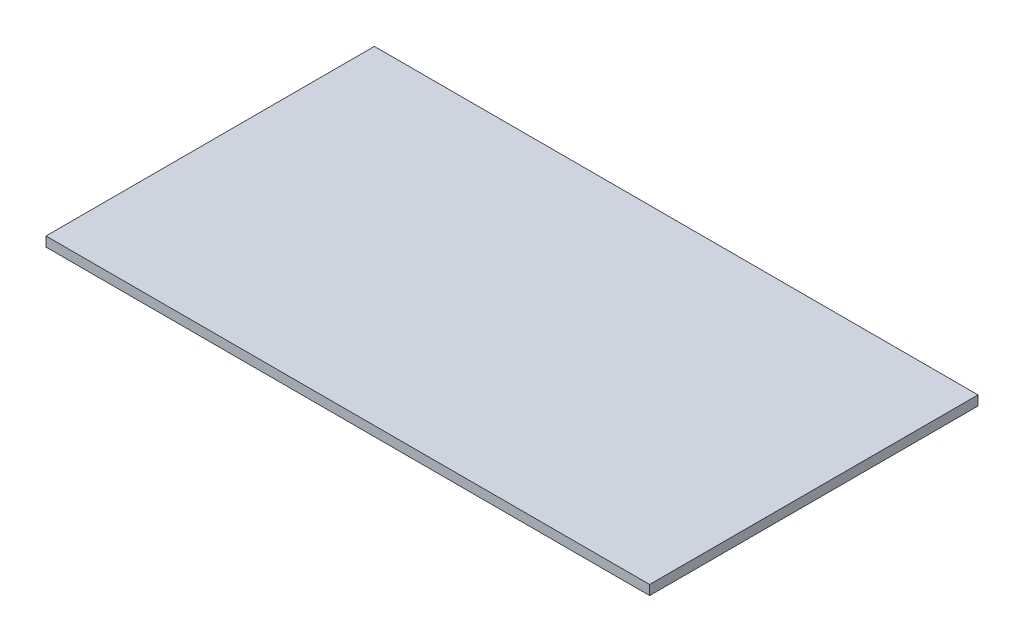
ISO-10303-21;
HEADER;
FILE_DESCRIPTION(('STEP AP214'),'2;1');
FILE_NAME('part.step','',(''),(''),'','','');
FILE_SCHEMA(('AUTOMOTIVE_DESIGN { 1 0 10303 214 1 1 1 1 }'));
ENDSEC;
DATA;
#1=APPLICATION_CONTEXT('core data for automotive mechanical design processes');
#2=APPLICATION_PROTOCOL_DEFINITION('international standard','automotive_design',2000,#1);
#3=PRODUCT_CONTEXT('',#1,'mechanical');
#4=PRODUCT('Part','Part','',(#3));
#5=PRODUCT_RELATED_PRODUCT_CATEGORY('part','',(#4));
#6=PRODUCT_DEFINITION_FORMATION('','',#4);
#7=PRODUCT_DEFINITION_CONTEXT('part definition',#1,'design');
#8=PRODUCT_DEFINITION('design','',#6,#7);
#9=PRODUCT_DEFINITION_SHAPE('','',#8);
#10=(LENGTH_UNIT() NAMED_UNIT(*) SI_UNIT(.MILLI.,.METRE.));
#11=(NAMED_UNIT(*) PLANE_ANGLE_UNIT() SI_UNIT($,.RADIAN.));
#12=(NAMED_UNIT(*) SI_UNIT($,.STERADIAN.) SOLID_ANGLE_UNIT());
#13=UNCERTAINTY_MEASURE_WITH_UNIT(LENGTH_MEASURE(1.E-05),#10,'distance_accuracy_value','');
#14=(GEOMETRIC_REPRESENTATION_CONTEXT(3) GLOBAL_UNCERTAINTY_ASSIGNED_CONTEXT((#13)) GLOBAL_UNIT_ASSIGNED_CONTEXT((#10,
#11,#12)) REPRESENTATION_CONTEXT('',''));
#15=CARTESIAN_POINT('',(0.,0.,0.));
#16=DIRECTION('',(0.,0.,1.));
#17=DIRECTION('',(1.,0.,0.));
#18=AXIS2_PLACEMENT_3D('',#15,#16,#17);
#19=CARTESIAN_POINT('',(-132.035842293907,4.,-136.));
#20=DIRECTION('',(1.,0.,0.));
#21=DIRECTION('',(0.,0.,-1.));
#22=AXIS2_PLACEMENT_3D('',#19,#20,#21);
#23=PLANE('',#22);
#24=DIRECTION('',(0.,0.,1.));
#25=VECTOR('',#24,1.);
#26=CARTESIAN_POINT('',(-132.035842293907,0.,-136.));
#27=LINE('',#26,#25);
#28=CARTESIAN_POINT('',(-132.035842293907,0.,-136.));
#29=VERTEX_POINT('',#28);
#30=CARTESIAN_POINT('',(-132.035842293907,0.,0.));
#31=VERTEX_POINT('',#30);
#32=EDGE_CURVE('E95',#29,#31,#27,.T.);
#33=ORIENTED_EDGE('',*,*,#32,.T.);
#34=DIRECTION('',(0.,-1.,0.));
#35=VECTOR('',#34,1.);
#36=CARTESIAN_POINT('',(-132.035842293907,4.,0.));
#37=LINE('',#36,#35);
#38=CARTESIAN_POINT('',(-132.035842293907,4.,0.));
#39=VERTEX_POINT('',#38);
#40=EDGE_CURVE('E11',#39,#31,#37,.T.);
#41=ORIENTED_EDGE('',*,*,#40,.F.);
#42=DIRECTION('',(0.,0.,1.));
#43=VECTOR('',#42,1.);
#44=CARTESIAN_POINT('',(-132.035842293907,4.,-136.));
#45=LINE('',#44,#43);
#46=CARTESIAN_POINT('',(-132.035842293907,4.,-136.));
#47=VERTEX_POINT('',#46);
#48=EDGE_CURVE('E83',#47,#39,#45,.T.);
#49=ORIENTED_EDGE('',*,*,#48,.F.);
#50=DIRECTION('',(0.,-1.,0.));
#51=VECTOR('',#50,1.);
#52=CARTESIAN_POINT('',(-132.035842293907,4.,-136.));
#53=LINE('',#52,#51);
#54=EDGE_CURVE('E91',#47,#29,#53,.T.);
#55=ORIENTED_EDGE('',*,*,#54,.T.);
#56=EDGE_LOOP('',(#33,#41,#49,#55));
#57=FACE_BOUND('',#56,.T.);
#58=ADVANCED_FACE('F32',(#57),#23,.F.);
#59=CARTESIAN_POINT('',(-132.035842293907,4.,0.));
#60=DIRECTION('',(0.,0.,-1.));
#61=DIRECTION('',(-1.,0.,0.));
#62=AXIS2_PLACEMENT_3D('',#59,#60,#61);
#63=PLANE('',#62);
#64=DIRECTION('',(1.,0.,0.));
#65=VECTOR('',#64,1.);
#66=CARTESIAN_POINT('',(-132.035842293907,0.,0.));
#67=LINE('',#66,#65);
#68=CARTESIAN_POINT('',(117.964157706093,0.,0.));
#69=VERTEX_POINT('',#68);
#70=EDGE_CURVE('E87',#31,#69,#67,.T.);
#71=ORIENTED_EDGE('',*,*,#70,.T.);
#72=DIRECTION('',(0.,-1.,0.));
#73=VECTOR('',#72,1.);
#74=CARTESIAN_POINT('',(117.964157706093,4.,0.));
#75=LINE('',#74,#73);
#76=CARTESIAN_POINT('',(117.964157706093,4.,0.));
#77=VERTEX_POINT('',#76);
#78=EDGE_CURVE('E40',#77,#69,#75,.T.);
#79=ORIENTED_EDGE('',*,*,#78,.F.);
#80=DIRECTION('',(1.,0.,0.));
#81=VECTOR('',#80,1.);
#82=CARTESIAN_POINT('',(-132.035842293907,4.,0.));
#83=LINE('',#82,#81);
#84=EDGE_CURVE('E78',#39,#77,#83,.T.);
#85=ORIENTED_EDGE('',*,*,#84,.F.);
#86=ORIENTED_EDGE('',*,*,#40,.T.);
#87=EDGE_LOOP('',(#71,#79,#85,#86));
#88=FACE_BOUND('',#87,.T.);
#89=ADVANCED_FACE('F86',(#88),#63,.F.);
#90=CARTESIAN_POINT('',(117.964157706093,4.,-136.));
#91=DIRECTION('',(-1.,0.,0.));
#92=DIRECTION('',(0.,0.,1.));
#93=AXIS2_PLACEMENT_3D('',#90,#91,#92);
#94=PLANE('',#93);
#95=DIRECTION('',(0.,0.,-1.));
#96=VECTOR('',#95,1.);
#97=CARTESIAN_POINT('',(117.964157706093,0.,-136.));
#98=LINE('',#97,#96);
#99=CARTESIAN_POINT('',(117.964157706093,0.,-136.));
#100=VERTEX_POINT('',#99);
#101=EDGE_CURVE('E65',#69,#100,#98,.T.);
#102=ORIENTED_EDGE('',*,*,#101,.T.);
#103=DIRECTION('',(0.,-1.,0.));
#104=VECTOR('',#103,1.);
#105=CARTESIAN_POINT('',(117.964157706093,4.,-136.));
#106=LINE('',#105,#104);
#107=CARTESIAN_POINT('',(117.964157706093,4.,-136.));
#108=VERTEX_POINT('',#107);
#109=EDGE_CURVE('E88',#108,#100,#106,.T.);
#110=ORIENTED_EDGE('',*,*,#109,.F.);
#111=DIRECTION('',(0.,0.,-1.));
#112=VECTOR('',#111,1.);
#113=CARTESIAN_POINT('',(117.964157706093,4.,-136.));
#114=LINE('',#113,#112);
#115=EDGE_CURVE('E81',#77,#108,#114,.T.);
#116=ORIENTED_EDGE('',*,*,#115,.F.);
#117=ORIENTED_EDGE('',*,*,#78,.T.);
#118=EDGE_LOOP('',(#102,#110,#116,#117));
#119=FACE_BOUND('',#118,.T.);
#120=ADVANCED_FACE('F89',(#119),#94,.F.);
#121=CARTESIAN_POINT('',(-132.035842293907,4.,-136.));
#122=DIRECTION('',(0.,0.,1.));
#123=DIRECTION('',(1.,0.,0.));
#124=AXIS2_PLACEMENT_3D('',#121,#122,#123);
#125=PLANE('',#124);
#126=DIRECTION('',(-1.,0.,0.));
#127=VECTOR('',#126,1.);
#128=CARTESIAN_POINT('',(-132.035842293907,0.,-136.));
#129=LINE('',#128,#127);
#130=EDGE_CURVE('E71',#100,#29,#129,.T.);
#131=ORIENTED_EDGE('',*,*,#130,.T.);
#132=ORIENTED_EDGE('',*,*,#54,.F.);
#133=DIRECTION('',(-1.,0.,0.));
#134=VECTOR('',#133,1.);
#135=CARTESIAN_POINT('',(-132.035842293907,4.,-136.));
#136=LINE('',#135,#134);
#137=EDGE_CURVE('E48',#108,#47,#136,.T.);
#138=ORIENTED_EDGE('',*,*,#137,.F.);
#139=ORIENTED_EDGE('',*,*,#109,.T.);
#140=EDGE_LOOP('',(#131,#132,#138,#139));
#141=FACE_BOUND('',#140,.T.);
#142=ADVANCED_FACE('F102',(#141),#125,.F.);
#143=CARTESIAN_POINT('',(0.,4.,0.));
#144=DIRECTION('',(0.,1.,0.));
#145=DIRECTION('',(0.,0.,1.));
#146=AXIS2_PLACEMENT_3D('',#143,#144,#145);
#147=PLANE('',#146);
#148=ORIENTED_EDGE('',*,*,#48,.T.);
#149=ORIENTED_EDGE('',*,*,#84,.T.);
#150=ORIENTED_EDGE('',*,*,#115,.T.);
#151=ORIENTED_EDGE('',*,*,#137,.T.);
#152=EDGE_LOOP('',(#148,#149,#150,#151));
#153=FACE_BOUND('',#152,.T.);
#154=ADVANCED_FACE('F79',(#153),#147,.T.);
#155=CARTESIAN_POINT('',(0.,0.,0.));
#156=DIRECTION('',(0.,1.,0.));
#157=DIRECTION('',(0.,0.,1.));
#158=AXIS2_PLACEMENT_3D('',#155,#156,#157);
#159=PLANE('',#158);
#160=ORIENTED_EDGE('',*,*,#32,.F.);
#161=ORIENTED_EDGE('',*,*,#130,.F.);
#162=ORIENTED_EDGE('',*,*,#101,.F.);
#163=ORIENTED_EDGE('',*,*,#70,.F.);
#164=EDGE_LOOP('',(#160,#161,#162,#163));
#165=FACE_BOUND('',#164,.T.);
#166=ADVANCED_FACE('F105',(#165),#159,.F.);
#167=CLOSED_SHELL('',(#58,#89,#120,#142,#154,#166));
#168=MANIFOLD_SOLID_BREP('B2',#167);
#169=ADVANCED_BREP_SHAPE_REPRESENTATION('',(#18,#168),#14);
#170=SHAPE_DEFINITION_REPRESENTATION(#9,#169);
ENDSEC;
END-ISO-10303-21;
